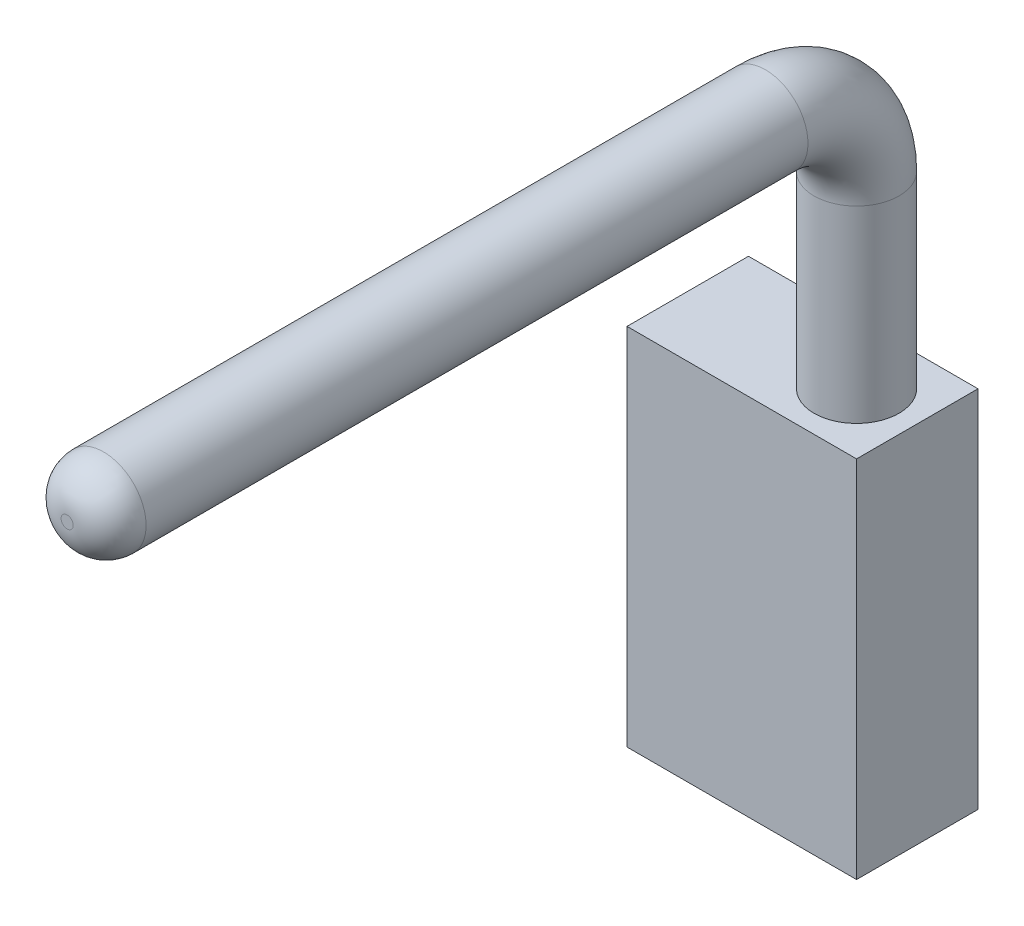
ISO-10303-21;
HEADER;
FILE_DESCRIPTION(('STEP AP214'),'2;1');
FILE_NAME('part.step','',(''),(''),'','','');
FILE_SCHEMA(('AUTOMOTIVE_DESIGN { 1 0 10303 214 1 1 1 1 }'));
ENDSEC;
DATA;
#1=APPLICATION_CONTEXT('core data for automotive mechanical design processes');
#2=APPLICATION_PROTOCOL_DEFINITION('international standard','automotive_design',2000,#1);
#3=PRODUCT_CONTEXT('',#1,'mechanical');
#4=PRODUCT('Part','Part','',(#3));
#5=PRODUCT_RELATED_PRODUCT_CATEGORY('part','',(#4));
#6=PRODUCT_DEFINITION_FORMATION('','',#4);
#7=PRODUCT_DEFINITION_CONTEXT('part definition',#1,'design');
#8=PRODUCT_DEFINITION('design','',#6,#7);
#9=PRODUCT_DEFINITION_SHAPE('','',#8);
#10=(LENGTH_UNIT() NAMED_UNIT(*) SI_UNIT(.MILLI.,.METRE.));
#11=(NAMED_UNIT(*) PLANE_ANGLE_UNIT() SI_UNIT($,.RADIAN.));
#12=(NAMED_UNIT(*) SI_UNIT($,.STERADIAN.) SOLID_ANGLE_UNIT());
#13=UNCERTAINTY_MEASURE_WITH_UNIT(LENGTH_MEASURE(1.E-05),#10,'distance_accuracy_value','');
#14=(GEOMETRIC_REPRESENTATION_CONTEXT(3) GLOBAL_UNCERTAINTY_ASSIGNED_CONTEXT((#13)) GLOBAL_UNIT_ASSIGNED_CONTEXT((#10,
#11,#12)) REPRESENTATION_CONTEXT('',''));
#15=CARTESIAN_POINT('',(0.,0.,0.));
#16=DIRECTION('',(0.,0.,1.));
#17=DIRECTION('',(1.,0.,0.));
#18=AXIS2_PLACEMENT_3D('',#15,#16,#17);
#19=CARTESIAN_POINT('',(12.0015,19.05,12.7));
#20=DIRECTION('',(0.,-1.,0.));
#21=DIRECTION('',(0.,0.,-1.));
#22=AXIS2_PLACEMENT_3D('',#19,#20,#21);
#23=PLANE('',#22);
#24=CARTESIAN_POINT('',(5.6515,19.05,6.35));
#25=DIRECTION('',(0.,1.,0.));
#26=DIRECTION('',(0.,0.,1.));
#27=AXIS2_PLACEMENT_3D('',#24,#25,#26);
#28=CIRCLE('',#27,4.445);
#29=CARTESIAN_POINT('',(5.6515,19.05,10.795));
#30=VERTEX_POINT('',#29);
#31=EDGE_CURVE('E146',#30,#30,#28,.T.);
#32=ORIENTED_EDGE('',*,*,#31,.F.);
#33=EDGE_LOOP('',(#32));
#34=FACE_BOUND('',#33,.T.);
#35=DIRECTION('',(-1.,0.,0.));
#36=VECTOR('',#35,1.);
#37=CARTESIAN_POINT('',(12.0015,19.05,0.));
#38=LINE('',#37,#36);
#39=CARTESIAN_POINT('',(12.0015,19.05,0.));
#40=VERTEX_POINT('',#39);
#41=CARTESIAN_POINT('',(-12.0015,19.05,0.));
#42=VERTEX_POINT('',#41);
#43=EDGE_CURVE('E130',#40,#42,#38,.T.);
#44=ORIENTED_EDGE('',*,*,#43,.T.);
#45=DIRECTION('',(0.,0.,-1.));
#46=VECTOR('',#45,1.);
#47=CARTESIAN_POINT('',(-12.0015,19.05,12.7));
#48=LINE('',#47,#46);
#49=CARTESIAN_POINT('',(-12.0015,19.05,12.7));
#50=VERTEX_POINT('',#49);
#51=EDGE_CURVE('E119',#50,#42,#48,.T.);
#52=ORIENTED_EDGE('',*,*,#51,.F.);
#53=DIRECTION('',(-1.,0.,0.));
#54=VECTOR('',#53,1.);
#55=CARTESIAN_POINT('',(12.0015,19.05,12.7));
#56=LINE('',#55,#54);
#57=CARTESIAN_POINT('',(12.0015,19.05,12.7));
#58=VERTEX_POINT('',#57);
#59=EDGE_CURVE('E111',#58,#50,#56,.T.);
#60=ORIENTED_EDGE('',*,*,#59,.F.);
#61=DIRECTION('',(0.,0.,-1.));
#62=VECTOR('',#61,1.);
#63=CARTESIAN_POINT('',(12.0015,19.05,12.7));
#64=LINE('',#63,#62);
#65=EDGE_CURVE('E126',#58,#40,#64,.T.);
#66=ORIENTED_EDGE('',*,*,#65,.T.);
#67=EDGE_LOOP('',(#44,#52,#60,#66));
#68=FACE_BOUND('',#67,.T.);
#69=ADVANCED_FACE('F49',(#34,#68),#23,.F.);
#70=CARTESIAN_POINT('',(-12.0015,-19.05,12.7));
#71=DIRECTION('',(1.,0.,0.));
#72=DIRECTION('',(0.,0.,-1.));
#73=AXIS2_PLACEMENT_3D('',#70,#71,#72);
#74=PLANE('',#73);
#75=DIRECTION('',(0.,-1.,0.));
#76=VECTOR('',#75,1.);
#77=CARTESIAN_POINT('',(-12.0015,-19.05,0.));
#78=LINE('',#77,#76);
#79=CARTESIAN_POINT('',(-12.0015,-19.05,0.));
#80=VERTEX_POINT('',#79);
#81=EDGE_CURVE('E117',#42,#80,#78,.T.);
#82=ORIENTED_EDGE('',*,*,#81,.T.);
#83=DIRECTION('',(0.,0.,-1.));
#84=VECTOR('',#83,1.);
#85=CARTESIAN_POINT('',(-12.0015,-19.05,12.7));
#86=LINE('',#85,#84);
#87=CARTESIAN_POINT('',(-12.0015,-19.05,12.7));
#88=VERTEX_POINT('',#87);
#89=EDGE_CURVE('E115',#88,#80,#86,.T.);
#90=ORIENTED_EDGE('',*,*,#89,.F.);
#91=DIRECTION('',(0.,-1.,0.));
#92=VECTOR('',#91,1.);
#93=CARTESIAN_POINT('',(-12.0015,-19.05,12.7));
#94=LINE('',#93,#92);
#95=EDGE_CURVE('E106',#50,#88,#94,.T.);
#96=ORIENTED_EDGE('',*,*,#95,.F.);
#97=ORIENTED_EDGE('',*,*,#51,.T.);
#98=EDGE_LOOP('',(#82,#90,#96,#97));
#99=FACE_BOUND('',#98,.T.);
#100=ADVANCED_FACE('F116',(#99),#74,.F.);
#101=CARTESIAN_POINT('',(12.0015,-19.05,12.7));
#102=DIRECTION('',(0.,1.,0.));
#103=DIRECTION('',(0.,0.,1.));
#104=AXIS2_PLACEMENT_3D('',#101,#102,#103);
#105=PLANE('',#104);
#106=DIRECTION('',(1.,0.,0.));
#107=VECTOR('',#106,1.);
#108=CARTESIAN_POINT('',(12.0015,-19.05,0.));
#109=LINE('',#108,#107);
#110=CARTESIAN_POINT('',(12.0015,-19.05,0.));
#111=VERTEX_POINT('',#110);
#112=EDGE_CURVE('E90',#80,#111,#109,.T.);
#113=ORIENTED_EDGE('',*,*,#112,.T.);
#114=DIRECTION('',(0.,0.,-1.));
#115=VECTOR('',#114,1.);
#116=CARTESIAN_POINT('',(12.0015,-19.05,12.7));
#117=LINE('',#116,#115);
#118=CARTESIAN_POINT('',(12.0015,-19.05,12.7));
#119=VERTEX_POINT('',#118);
#120=EDGE_CURVE('E120',#119,#111,#117,.T.);
#121=ORIENTED_EDGE('',*,*,#120,.F.);
#122=DIRECTION('',(1.,0.,0.));
#123=VECTOR('',#122,1.);
#124=CARTESIAN_POINT('',(12.0015,-19.05,12.7));
#125=LINE('',#124,#123);
#126=EDGE_CURVE('E109',#88,#119,#125,.T.);
#127=ORIENTED_EDGE('',*,*,#126,.F.);
#128=ORIENTED_EDGE('',*,*,#89,.T.);
#129=EDGE_LOOP('',(#113,#121,#127,#128));
#130=FACE_BOUND('',#129,.T.);
#131=ADVANCED_FACE('F122',(#130),#105,.F.);
#132=CARTESIAN_POINT('',(12.0015,-19.05,12.7));
#133=DIRECTION('',(-1.,0.,0.));
#134=DIRECTION('',(0.,0.,1.));
#135=AXIS2_PLACEMENT_3D('',#132,#133,#134);
#136=PLANE('',#135);
#137=DIRECTION('',(0.,1.,0.));
#138=VECTOR('',#137,1.);
#139=CARTESIAN_POINT('',(12.0015,-19.05,0.));
#140=LINE('',#139,#138);
#141=EDGE_CURVE('E96',#111,#40,#140,.T.);
#142=ORIENTED_EDGE('',*,*,#141,.T.);
#143=ORIENTED_EDGE('',*,*,#65,.F.);
#144=DIRECTION('',(0.,1.,0.));
#145=VECTOR('',#144,1.);
#146=CARTESIAN_POINT('',(12.0015,-19.05,12.7));
#147=LINE('',#146,#145);
#148=EDGE_CURVE('E70',#119,#58,#147,.T.);
#149=ORIENTED_EDGE('',*,*,#148,.F.);
#150=ORIENTED_EDGE('',*,*,#120,.T.);
#151=EDGE_LOOP('',(#142,#143,#149,#150));
#152=FACE_BOUND('',#151,.T.);
#153=ADVANCED_FACE('F194',(#152),#136,.F.);
#154=CARTESIAN_POINT('',(0.,0.,12.7));
#155=DIRECTION('',(0.,0.,-1.));
#156=DIRECTION('',(-1.,0.,0.));
#157=AXIS2_PLACEMENT_3D('',#154,#155,#156);
#158=PLANE('',#157);
#159=ORIENTED_EDGE('',*,*,#59,.T.);
#160=ORIENTED_EDGE('',*,*,#95,.T.);
#161=ORIENTED_EDGE('',*,*,#126,.T.);
#162=ORIENTED_EDGE('',*,*,#148,.T.);
#163=EDGE_LOOP('',(#159,#160,#161,#162));
#164=FACE_BOUND('',#163,.T.);
#165=ADVANCED_FACE('F107',(#164),#158,.F.);
#166=CARTESIAN_POINT('',(0.,0.,0.));
#167=DIRECTION('',(0.,0.,-1.));
#168=DIRECTION('',(-1.,0.,0.));
#169=AXIS2_PLACEMENT_3D('',#166,#167,#168);
#170=PLANE('',#169);
#171=ORIENTED_EDGE('',*,*,#43,.F.);
#172=ORIENTED_EDGE('',*,*,#141,.F.);
#173=ORIENTED_EDGE('',*,*,#112,.F.);
#174=ORIENTED_EDGE('',*,*,#81,.F.);
#175=EDGE_LOOP('',(#171,#172,#173,#174));
#176=FACE_BOUND('',#175,.T.);
#177=ADVANCED_FACE('F182',(#176),#170,.T.);
#178=CARTESIAN_POINT('',(5.6515,48.26,88.9));
#179=DIRECTION('',(0.,0.,1.));
#180=DIRECTION('',(0.,-1.,0.));
#181=AXIS2_PLACEMENT_3D('',#178,#179,#180);
#182=PLANE('',#181);
#183=CARTESIAN_POINT('',(5.6515,48.26,88.9));
#184=DIRECTION('',(0.,0.,1.));
#185=DIRECTION('',(0.,-1.,0.));
#186=AXIS2_PLACEMENT_3D('',#183,#184,#185);
#187=CIRCLE('',#186,0.635);
#188=CARTESIAN_POINT('',(5.6515,47.625,88.9));
#189=VERTEX_POINT('',#188);
#190=EDGE_CURVE('E59',#189,#189,#187,.T.);
#191=ORIENTED_EDGE('',*,*,#190,.T.);
#192=EDGE_LOOP('',(#191));
#193=FACE_BOUND('',#192,.T.);
#194=ADVANCED_FACE('F176',(#193),#182,.T.);
#195=CARTESIAN_POINT('',(5.6515,19.05,6.35));
#196=DIRECTION('',(0.,1.,0.));
#197=DIRECTION('',(0.,0.,1.));
#198=AXIS2_PLACEMENT_3D('',#195,#196,#197);
#199=CYLINDRICAL_SURFACE('',#198,4.445);
#200=CARTESIAN_POINT('',(5.6515,38.735,6.35));
#201=DIRECTION('',(0.,1.,0.));
#202=DIRECTION('',(0.,0.,1.));
#203=AXIS2_PLACEMENT_3D('',#200,#201,#202);
#204=CIRCLE('',#203,4.445);
#205=CARTESIAN_POINT('',(5.6515,38.735,1.90500000000002));
#206=VERTEX_POINT('',#205);
#207=EDGE_CURVE('E157',#206,#206,#204,.T.);
#208=ORIENTED_EDGE('',*,*,#207,.F.);
#209=EDGE_LOOP('',(#208));
#210=FACE_BOUND('',#209,.T.);
#211=ORIENTED_EDGE('',*,*,#31,.T.);
#212=EDGE_LOOP('',(#211));
#213=FACE_BOUND('',#212,.T.);
#214=ADVANCED_FACE('F171',(#210,#213),#199,.T.);
#215=CARTESIAN_POINT('',(5.6515,38.735,15.875));
#216=DIRECTION('',(1.,0.,0.));
#217=DIRECTION('',(0.,0.,-1.));
#218=AXIS2_PLACEMENT_3D('',#215,#216,#217);
#219=TOROIDAL_SURFACE('',#218,9.52499999999998,4.445);
#220=CARTESIAN_POINT('',(5.6515,48.26,15.875));
#221=DIRECTION('',(0.,0.,1.));
#222=DIRECTION('',(0.,-1.,0.));
#223=AXIS2_PLACEMENT_3D('',#220,#221,#222);
#224=CIRCLE('',#223,4.445);
#225=CARTESIAN_POINT('',(5.6515,52.705,15.875));
#226=VERTEX_POINT('',#225);
#227=EDGE_CURVE('E134',#226,#226,#224,.T.);
#228=CARTESIAN_POINT('',(5.6515,38.735,15.875));
#229=DIRECTION('',(1.,0.,0.));
#230=DIRECTION('',(0.,0.,-1.));
#231=AXIS2_PLACEMENT_3D('',#228,#229,#230);
#232=CIRCLE('',#231,13.97);
#233=EDGE_CURVE('',#206,#226,#232,.T.);
#234=ORIENTED_EDGE('',*,*,#207,.T.);
#235=ORIENTED_EDGE('',*,*,#227,.F.);
#236=ORIENTED_EDGE('',*,*,#233,.T.);
#237=ORIENTED_EDGE('',*,*,#233,.F.);
#238=EDGE_LOOP('',(#234,#236,#235,#237));
#239=FACE_BOUND('',#238,.T.);
#240=ADVANCED_FACE('F168',(#239),#219,.T.);
#241=CARTESIAN_POINT('',(5.6515,48.26,15.875));
#242=DIRECTION('',(0.,0.,1.));
#243=DIRECTION('',(0.,-1.,0.));
#244=AXIS2_PLACEMENT_3D('',#241,#242,#243);
#245=CYLINDRICAL_SURFACE('',#244,4.445);
#246=CARTESIAN_POINT('',(5.6515,48.26,85.09));
#247=DIRECTION('',(0.,0.,1.));
#248=DIRECTION('',(0.,-1.,0.));
#249=AXIS2_PLACEMENT_3D('',#246,#247,#248);
#250=CIRCLE('',#249,4.445);
#251=CARTESIAN_POINT('',(5.6515,43.815,85.09));
#252=VERTEX_POINT('',#251);
#253=EDGE_CURVE('E11',#252,#252,#250,.F.);
#254=ORIENTED_EDGE('',*,*,#253,.T.);
#255=EDGE_LOOP('',(#254));
#256=FACE_BOUND('',#255,.T.);
#257=ORIENTED_EDGE('',*,*,#227,.T.);
#258=EDGE_LOOP('',(#257));
#259=FACE_BOUND('',#258,.T.);
#260=ADVANCED_FACE('F166',(#256,#259),#245,.T.);
#261=CARTESIAN_POINT('',(5.6515,48.26,85.09));
#262=DIRECTION('',(0.,0.,1.));
#263=DIRECTION('',(0.,-1.,0.));
#264=AXIS2_PLACEMENT_3D('',#261,#262,#263);
#265=DEGENERATE_TOROIDAL_SURFACE('',#264,0.635,3.81,.T.);
#266=ORIENTED_EDGE('',*,*,#253,.F.);
#267=EDGE_LOOP('',(#266));
#268=FACE_BOUND('',#267,.T.);
#269=ORIENTED_EDGE('',*,*,#190,.F.);
#270=EDGE_LOOP('',(#269));
#271=FACE_BOUND('',#270,.T.);
#272=ADVANCED_FACE('F51',(#268,#271),#265,.T.);
#273=CLOSED_SHELL('',(#69,#100,#131,#153,#165,#177,#194,#214,#240,#260,#272));
#274=MANIFOLD_SOLID_BREP('B2',#273);
#275=ADVANCED_BREP_SHAPE_REPRESENTATION('',(#18,#274),#14);
#276=SHAPE_DEFINITION_REPRESENTATION(#9,#275);
ENDSEC;
END-ISO-10303-21;
